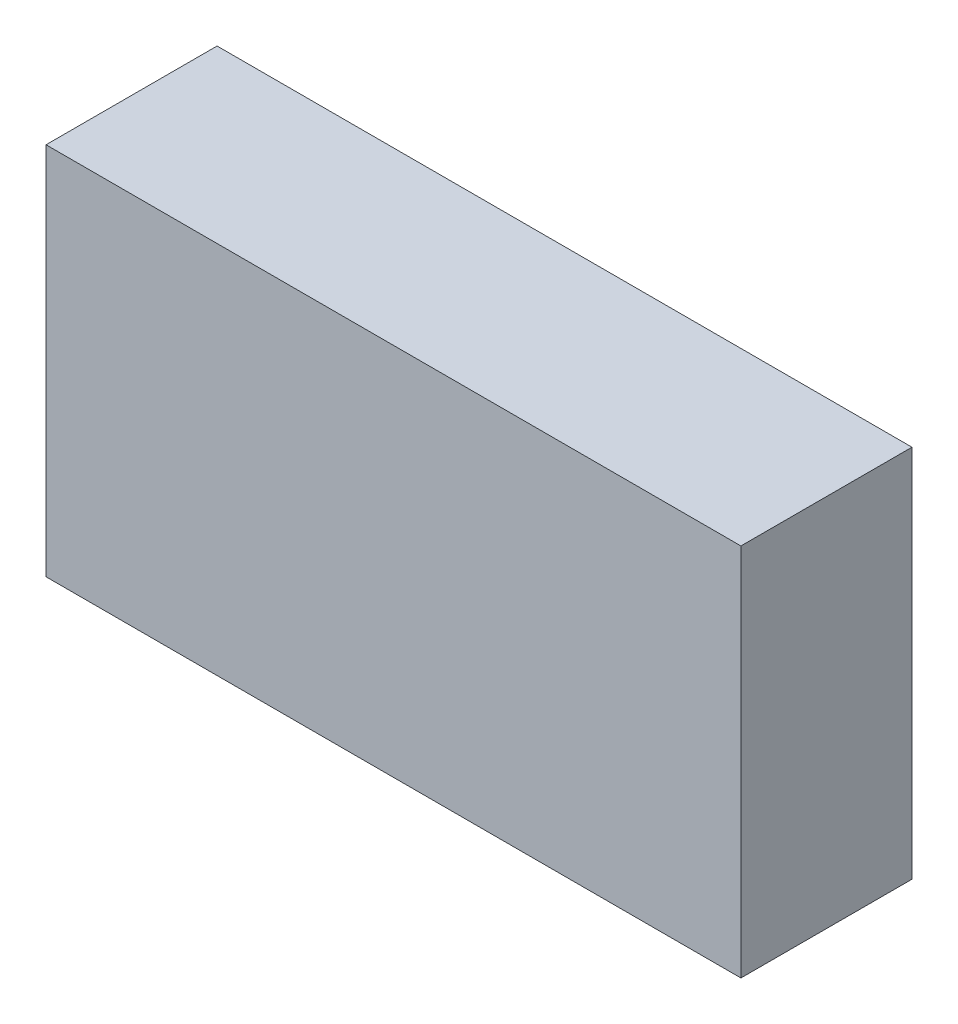
ISO-10303-21;
HEADER;
FILE_DESCRIPTION(('STEP AP214'),'2;1');
FILE_NAME('part.step','',(''),(''),'','','');
FILE_SCHEMA(('AUTOMOTIVE_DESIGN { 1 0 10303 214 1 1 1 1 }'));
ENDSEC;
DATA;
#1=APPLICATION_CONTEXT('core data for automotive mechanical design processes');
#2=APPLICATION_PROTOCOL_DEFINITION('international standard','automotive_design',2000,#1);
#3=PRODUCT_CONTEXT('',#1,'mechanical');
#4=PRODUCT('Part','Part','',(#3));
#5=PRODUCT_RELATED_PRODUCT_CATEGORY('part','',(#4));
#6=PRODUCT_DEFINITION_FORMATION('','',#4);
#7=PRODUCT_DEFINITION_CONTEXT('part definition',#1,'design');
#8=PRODUCT_DEFINITION('design','',#6,#7);
#9=PRODUCT_DEFINITION_SHAPE('','',#8);
#10=(LENGTH_UNIT() NAMED_UNIT(*) SI_UNIT(.MILLI.,.METRE.));
#11=(NAMED_UNIT(*) PLANE_ANGLE_UNIT() SI_UNIT($,.RADIAN.));
#12=(NAMED_UNIT(*) SI_UNIT($,.STERADIAN.) SOLID_ANGLE_UNIT());
#13=UNCERTAINTY_MEASURE_WITH_UNIT(LENGTH_MEASURE(1.E-05),#10,'distance_accuracy_value','');
#14=(GEOMETRIC_REPRESENTATION_CONTEXT(3) GLOBAL_UNCERTAINTY_ASSIGNED_CONTEXT((#13)) GLOBAL_UNIT_ASSIGNED_CONTEXT((#10,
#11,#12)) REPRESENTATION_CONTEXT('',''));
#15=CARTESIAN_POINT('',(0.,0.,0.));
#16=DIRECTION('',(0.,0.,1.));
#17=DIRECTION('',(1.,0.,0.));
#18=AXIS2_PLACEMENT_3D('',#15,#16,#17);
#19=CARTESIAN_POINT('',(-56.,-170.,219.5));
#20=DIRECTION('',(0.,0.,1.));
#21=DIRECTION('',(1.,0.,0.));
#22=AXIS2_PLACEMENT_3D('',#19,#20,#21);
#23=PLANE('',#22);
#24=DIRECTION('',(0.,1.,0.));
#25=VECTOR('',#24,1.);
#26=CARTESIAN_POINT('',(-56.,-170.,219.5));
#27=LINE('',#26,#25);
#28=CARTESIAN_POINT('',(-56.,-170.,219.5));
#29=VERTEX_POINT('',#28);
#30=CARTESIAN_POINT('',(-56.,-100.,219.5));
#31=VERTEX_POINT('',#30);
#32=EDGE_CURVE('E102',#29,#31,#27,.T.);
#33=ORIENTED_EDGE('',*,*,#32,.F.);
#34=DIRECTION('',(1.,0.,0.));
#35=VECTOR('',#34,1.);
#36=CARTESIAN_POINT('',(-56.,-170.,219.5));
#37=LINE('',#36,#35);
#38=CARTESIAN_POINT('',(74.,-170.,219.5));
#39=VERTEX_POINT('',#38);
#40=EDGE_CURVE('E78',#29,#39,#37,.T.);
#41=ORIENTED_EDGE('',*,*,#40,.T.);
#42=DIRECTION('',(0.,1.,0.));
#43=VECTOR('',#42,1.);
#44=CARTESIAN_POINT('',(74.,-170.,219.5));
#45=LINE('',#44,#43);
#46=CARTESIAN_POINT('',(74.,-100.,219.5));
#47=VERTEX_POINT('',#46);
#48=EDGE_CURVE('E18',#39,#47,#45,.T.);
#49=ORIENTED_EDGE('',*,*,#48,.T.);
#50=DIRECTION('',(1.,0.,0.));
#51=VECTOR('',#50,1.);
#52=CARTESIAN_POINT('',(-56.,-100.,219.5));
#53=LINE('',#52,#51);
#54=EDGE_CURVE('E9',#31,#47,#53,.T.);
#55=ORIENTED_EDGE('',*,*,#54,.F.);
#56=EDGE_LOOP('',(#33,#41,#49,#55));
#57=FACE_BOUND('',#56,.T.);
#58=ADVANCED_FACE('F14',(#57),#23,.T.);
#59=CARTESIAN_POINT('',(-56.,-170.,187.5));
#60=DIRECTION('',(0.,0.,1.));
#61=DIRECTION('',(1.,0.,0.));
#62=AXIS2_PLACEMENT_3D('',#59,#60,#61);
#63=PLANE('',#62);
#64=DIRECTION('',(1.,0.,0.));
#65=VECTOR('',#64,1.);
#66=CARTESIAN_POINT('',(-56.,-100.,187.5));
#67=LINE('',#66,#65);
#68=CARTESIAN_POINT('',(-56.,-100.,187.5));
#69=VERTEX_POINT('',#68);
#70=CARTESIAN_POINT('',(74.,-100.,187.5));
#71=VERTEX_POINT('',#70);
#72=EDGE_CURVE('E24',#69,#71,#67,.T.);
#73=ORIENTED_EDGE('',*,*,#72,.T.);
#74=DIRECTION('',(0.,1.,0.));
#75=VECTOR('',#74,1.);
#76=CARTESIAN_POINT('',(74.,-170.,187.5));
#77=LINE('',#76,#75);
#78=CARTESIAN_POINT('',(74.,-170.,187.5));
#79=VERTEX_POINT('',#78);
#80=EDGE_CURVE('E80',#79,#71,#77,.T.);
#81=ORIENTED_EDGE('',*,*,#80,.F.);
#82=DIRECTION('',(1.,0.,0.));
#83=VECTOR('',#82,1.);
#84=CARTESIAN_POINT('',(-56.,-170.,187.5));
#85=LINE('',#84,#83);
#86=CARTESIAN_POINT('',(-56.,-170.,187.5));
#87=VERTEX_POINT('',#86);
#88=EDGE_CURVE('E70',#87,#79,#85,.T.);
#89=ORIENTED_EDGE('',*,*,#88,.F.);
#90=DIRECTION('',(0.,1.,0.));
#91=VECTOR('',#90,1.);
#92=CARTESIAN_POINT('',(-56.,-170.,187.5));
#93=LINE('',#92,#91);
#94=EDGE_CURVE('E93',#87,#69,#93,.T.);
#95=ORIENTED_EDGE('',*,*,#94,.T.);
#96=EDGE_LOOP('',(#73,#81,#89,#95));
#97=FACE_BOUND('',#96,.T.);
#98=ADVANCED_FACE('F16',(#97),#63,.F.);
#99=CARTESIAN_POINT('',(-56.,-100.,187.5));
#100=DIRECTION('',(0.,1.,0.));
#101=DIRECTION('',(1.,0.,0.));
#102=AXIS2_PLACEMENT_3D('',#99,#100,#101);
#103=PLANE('',#102);
#104=ORIENTED_EDGE('',*,*,#72,.F.);
#105=DIRECTION('',(0.,0.,1.));
#106=VECTOR('',#105,1.);
#107=CARTESIAN_POINT('',(-56.,-100.,187.5));
#108=LINE('',#107,#106);
#109=EDGE_CURVE('E100',#69,#31,#108,.T.);
#110=ORIENTED_EDGE('',*,*,#109,.T.);
#111=ORIENTED_EDGE('',*,*,#54,.T.);
#112=DIRECTION('',(0.,0.,1.));
#113=VECTOR('',#112,1.);
#114=CARTESIAN_POINT('',(74.,-100.,187.5));
#115=LINE('',#114,#113);
#116=EDGE_CURVE('E84',#71,#47,#115,.T.);
#117=ORIENTED_EDGE('',*,*,#116,.F.);
#118=EDGE_LOOP('',(#104,#110,#111,#117));
#119=FACE_BOUND('',#118,.T.);
#120=ADVANCED_FACE('F121',(#119),#103,.T.);
#121=CARTESIAN_POINT('',(-56.,-170.,187.5));
#122=DIRECTION('',(0.,1.,0.));
#123=DIRECTION('',(1.,0.,0.));
#124=AXIS2_PLACEMENT_3D('',#121,#122,#123);
#125=PLANE('',#124);
#126=DIRECTION('',(0.,0.,1.));
#127=VECTOR('',#126,1.);
#128=CARTESIAN_POINT('',(74.,-170.,187.5));
#129=LINE('',#128,#127);
#130=EDGE_CURVE('E73',#79,#39,#129,.T.);
#131=ORIENTED_EDGE('',*,*,#130,.T.);
#132=ORIENTED_EDGE('',*,*,#40,.F.);
#133=DIRECTION('',(0.,0.,1.));
#134=VECTOR('',#133,1.);
#135=CARTESIAN_POINT('',(-56.,-170.,187.5));
#136=LINE('',#135,#134);
#137=EDGE_CURVE('E75',#87,#29,#136,.T.);
#138=ORIENTED_EDGE('',*,*,#137,.F.);
#139=ORIENTED_EDGE('',*,*,#88,.T.);
#140=EDGE_LOOP('',(#131,#132,#138,#139));
#141=FACE_BOUND('',#140,.T.);
#142=ADVANCED_FACE('F71',(#141),#125,.F.);
#143=CARTESIAN_POINT('',(74.,-170.,187.5));
#144=DIRECTION('',(1.,0.,0.));
#145=DIRECTION('',(0.,1.,0.));
#146=AXIS2_PLACEMENT_3D('',#143,#144,#145);
#147=PLANE('',#146);
#148=ORIENTED_EDGE('',*,*,#130,.F.);
#149=ORIENTED_EDGE('',*,*,#80,.T.);
#150=ORIENTED_EDGE('',*,*,#116,.T.);
#151=ORIENTED_EDGE('',*,*,#48,.F.);
#152=EDGE_LOOP('',(#148,#149,#150,#151));
#153=FACE_BOUND('',#152,.T.);
#154=ADVANCED_FACE('F87',(#153),#147,.T.);
#155=CARTESIAN_POINT('',(-56.,-170.,187.5));
#156=DIRECTION('',(1.,0.,0.));
#157=DIRECTION('',(0.,1.,0.));
#158=AXIS2_PLACEMENT_3D('',#155,#156,#157);
#159=PLANE('',#158);
#160=ORIENTED_EDGE('',*,*,#32,.T.);
#161=ORIENTED_EDGE('',*,*,#109,.F.);
#162=ORIENTED_EDGE('',*,*,#94,.F.);
#163=ORIENTED_EDGE('',*,*,#137,.T.);
#164=EDGE_LOOP('',(#160,#161,#162,#163));
#165=FACE_BOUND('',#164,.T.);
#166=ADVANCED_FACE('F118',(#165),#159,.F.);
#167=CLOSED_SHELL('',(#58,#98,#120,#142,#154,#166));
#168=MANIFOLD_SOLID_BREP('B1',#167);
#169=ADVANCED_BREP_SHAPE_REPRESENTATION('',(#18,#168),#14);
#170=SHAPE_DEFINITION_REPRESENTATION(#9,#169);
ENDSEC;
END-ISO-10303-21;
